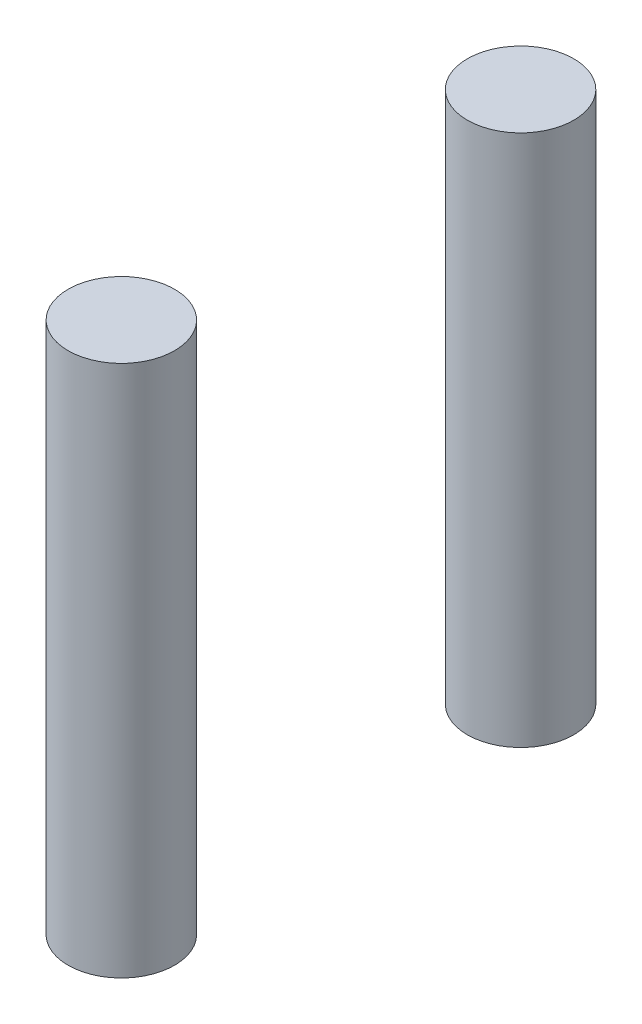
ISO-10303-21;
HEADER;
FILE_DESCRIPTION(('STEP AP214'),'2;1');
FILE_NAME('part.step','',(''),(''),'','','');
FILE_SCHEMA(('AUTOMOTIVE_DESIGN { 1 0 10303 214 1 1 1 1 }'));
ENDSEC;
DATA;
#1=APPLICATION_CONTEXT('core data for automotive mechanical design processes');
#2=APPLICATION_PROTOCOL_DEFINITION('international standard','automotive_design',2000,#1);
#3=PRODUCT_CONTEXT('',#1,'mechanical');
#4=PRODUCT('Part','Part','',(#3));
#5=PRODUCT_RELATED_PRODUCT_CATEGORY('part','',(#4));
#6=PRODUCT_DEFINITION_FORMATION('','',#4);
#7=PRODUCT_DEFINITION_CONTEXT('part definition',#1,'design');
#8=PRODUCT_DEFINITION('design','',#6,#7);
#9=PRODUCT_DEFINITION_SHAPE('','',#8);
#10=(LENGTH_UNIT() NAMED_UNIT(*) SI_UNIT(.MILLI.,.METRE.));
#11=(NAMED_UNIT(*) PLANE_ANGLE_UNIT() SI_UNIT($,.RADIAN.));
#12=(NAMED_UNIT(*) SI_UNIT($,.STERADIAN.) SOLID_ANGLE_UNIT());
#13=UNCERTAINTY_MEASURE_WITH_UNIT(LENGTH_MEASURE(1.E-05),#10,'distance_accuracy_value','');
#14=(GEOMETRIC_REPRESENTATION_CONTEXT(3) GLOBAL_UNCERTAINTY_ASSIGNED_CONTEXT((#13)) GLOBAL_UNIT_ASSIGNED_CONTEXT((#10,
#11,#12)) REPRESENTATION_CONTEXT('',''));
#15=CARTESIAN_POINT('',(0.,0.,0.));
#16=DIRECTION('',(0.,0.,1.));
#17=DIRECTION('',(1.,0.,0.));
#18=AXIS2_PLACEMENT_3D('',#15,#16,#17);
#19=CARTESIAN_POINT('',(0.,-13.,-3.75));
#20=DIRECTION('',(0.,1.,0.));
#21=DIRECTION('',(0.,0.,1.));
#22=AXIS2_PLACEMENT_3D('',#19,#20,#21);
#23=CYLINDRICAL_SURFACE('',#22,1.);
#24=CARTESIAN_POINT('',(0.,-13.,-3.75));
#25=DIRECTION('',(0.,1.,0.));
#26=DIRECTION('',(0.,0.,1.));
#27=AXIS2_PLACEMENT_3D('',#24,#25,#26);
#28=CIRCLE('',#27,1.);
#29=CARTESIAN_POINT('',(0.,-13.,-2.75));
#30=VERTEX_POINT('',#29);
#31=EDGE_CURVE('E11',#30,#30,#28,.T.);
#32=ORIENTED_EDGE('',*,*,#31,.T.);
#33=EDGE_LOOP('',(#32));
#34=FACE_BOUND('',#33,.T.);
#35=CARTESIAN_POINT('',(0.,-3.,-3.75));
#36=DIRECTION('',(0.,1.,0.));
#37=DIRECTION('',(0.,0.,1.));
#38=AXIS2_PLACEMENT_3D('',#35,#36,#37);
#39=CIRCLE('',#38,1.);
#40=CARTESIAN_POINT('',(0.,-3.,-2.75));
#41=VERTEX_POINT('',#40);
#42=EDGE_CURVE('E44',#41,#41,#39,.T.);
#43=ORIENTED_EDGE('',*,*,#42,.F.);
#44=EDGE_LOOP('',(#43));
#45=FACE_BOUND('',#44,.T.);
#46=ADVANCED_FACE('F41',(#34,#45),#23,.T.);
#47=CARTESIAN_POINT('',(0.,-13.,-3.75));
#48=DIRECTION('',(0.,1.,0.));
#49=DIRECTION('',(0.,0.,1.));
#50=AXIS2_PLACEMENT_3D('',#47,#48,#49);
#51=PLANE('',#50);
#52=ORIENTED_EDGE('',*,*,#31,.F.);
#53=EDGE_LOOP('',(#52));
#54=FACE_BOUND('',#53,.T.);
#55=ADVANCED_FACE('F56',(#54),#51,.F.);
#56=CARTESIAN_POINT('',(0.,-3.,-3.75));
#57=DIRECTION('',(0.,1.,0.));
#58=DIRECTION('',(0.,0.,1.));
#59=AXIS2_PLACEMENT_3D('',#56,#57,#58);
#60=PLANE('',#59);
#61=ORIENTED_EDGE('',*,*,#42,.T.);
#62=EDGE_LOOP('',(#61));
#63=FACE_BOUND('',#62,.T.);
#64=ADVANCED_FACE('F53',(#63),#60,.T.);
#65=CLOSED_SHELL('',(#46,#55,#64));
#66=MANIFOLD_SOLID_BREP('B2',#65);
#67=CARTESIAN_POINT('',(0.,-13.,3.75));
#68=DIRECTION('',(0.,1.,0.));
#69=DIRECTION('',(0.,0.,1.));
#70=AXIS2_PLACEMENT_3D('',#67,#68,#69);
#71=CYLINDRICAL_SURFACE('',#70,1.);
#72=CARTESIAN_POINT('',(0.,-13.,3.75));
#73=DIRECTION('',(0.,1.,0.));
#74=DIRECTION('',(0.,0.,1.));
#75=AXIS2_PLACEMENT_3D('',#72,#73,#74);
#76=CIRCLE('',#75,1.);
#77=CARTESIAN_POINT('',(0.,-13.,4.75));
#78=VERTEX_POINT('',#77);
#79=EDGE_CURVE('E40',#78,#78,#76,.T.);
#80=ORIENTED_EDGE('',*,*,#79,.T.);
#81=EDGE_LOOP('',(#80));
#82=FACE_BOUND('',#81,.T.);
#83=CARTESIAN_POINT('',(0.,-3.,3.75));
#84=DIRECTION('',(0.,1.,0.));
#85=DIRECTION('',(0.,0.,1.));
#86=AXIS2_PLACEMENT_3D('',#83,#84,#85);
#87=CIRCLE('',#86,1.);
#88=CARTESIAN_POINT('',(0.,-3.,4.75));
#89=VERTEX_POINT('',#88);
#90=EDGE_CURVE('E85',#89,#89,#87,.T.);
#91=ORIENTED_EDGE('',*,*,#90,.F.);
#92=EDGE_LOOP('',(#91));
#93=FACE_BOUND('',#92,.T.);
#94=ADVANCED_FACE('F82',(#82,#93),#71,.T.);
#95=CARTESIAN_POINT('',(0.,-13.,3.75));
#96=DIRECTION('',(0.,1.,0.));
#97=DIRECTION('',(0.,0.,1.));
#98=AXIS2_PLACEMENT_3D('',#95,#96,#97);
#99=PLANE('',#98);
#100=ORIENTED_EDGE('',*,*,#79,.F.);
#101=EDGE_LOOP('',(#100));
#102=FACE_BOUND('',#101,.T.);
#103=ADVANCED_FACE('F97',(#102),#99,.F.);
#104=CARTESIAN_POINT('',(0.,-3.,3.75));
#105=DIRECTION('',(0.,1.,0.));
#106=DIRECTION('',(0.,0.,1.));
#107=AXIS2_PLACEMENT_3D('',#104,#105,#106);
#108=PLANE('',#107);
#109=ORIENTED_EDGE('',*,*,#90,.T.);
#110=EDGE_LOOP('',(#109));
#111=FACE_BOUND('',#110,.T.);
#112=ADVANCED_FACE('F94',(#111),#108,.T.);
#113=CLOSED_SHELL('',(#94,#103,#112));
#114=MANIFOLD_SOLID_BREP('B6',#113);
#115=ADVANCED_BREP_SHAPE_REPRESENTATION('',(#18,#66,#114),#14);
#116=SHAPE_DEFINITION_REPRESENTATION(#9,#115);
ENDSEC;
END-ISO-10303-21;
